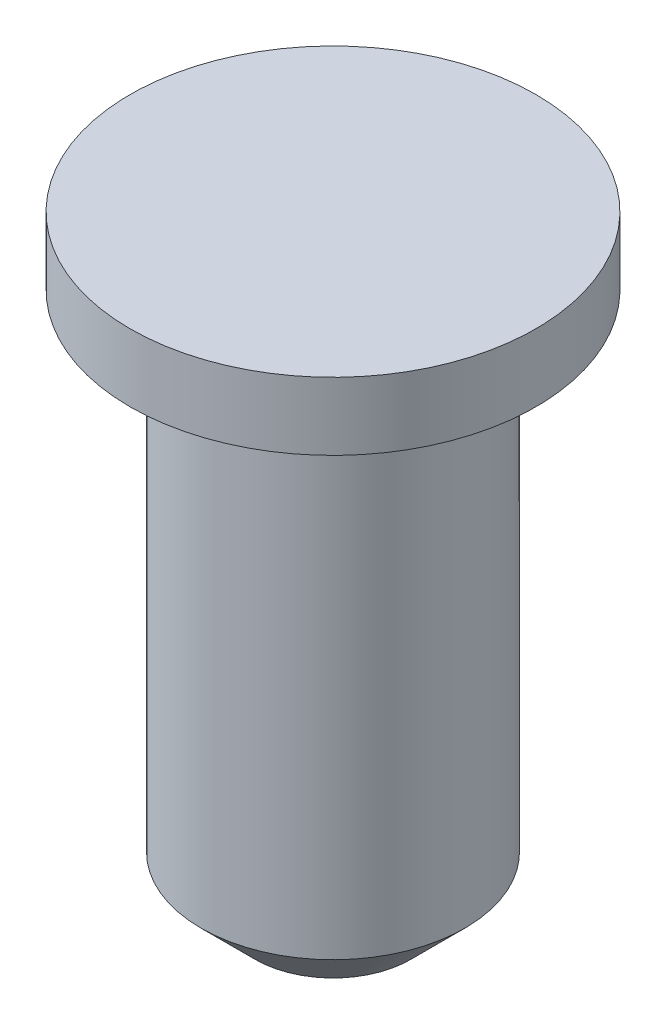
ISO-10303-21;
HEADER;
FILE_DESCRIPTION(('STEP AP214'),'2;1');
FILE_NAME('part.step','',(''),(''),'','','');
FILE_SCHEMA(('AUTOMOTIVE_DESIGN { 1 0 10303 214 1 1 1 1 }'));
ENDSEC;
DATA;
#1=APPLICATION_CONTEXT('core data for automotive mechanical design processes');
#2=APPLICATION_PROTOCOL_DEFINITION('international standard','automotive_design',2000,#1);
#3=PRODUCT_CONTEXT('',#1,'mechanical');
#4=PRODUCT('Part','Part','',(#3));
#5=PRODUCT_RELATED_PRODUCT_CATEGORY('part','',(#4));
#6=PRODUCT_DEFINITION_FORMATION('','',#4);
#7=PRODUCT_DEFINITION_CONTEXT('part definition',#1,'design');
#8=PRODUCT_DEFINITION('design','',#6,#7);
#9=PRODUCT_DEFINITION_SHAPE('','',#8);
#10=(LENGTH_UNIT() NAMED_UNIT(*) SI_UNIT(.MILLI.,.METRE.));
#11=(NAMED_UNIT(*) PLANE_ANGLE_UNIT() SI_UNIT($,.RADIAN.));
#12=(NAMED_UNIT(*) SI_UNIT($,.STERADIAN.) SOLID_ANGLE_UNIT());
#13=UNCERTAINTY_MEASURE_WITH_UNIT(LENGTH_MEASURE(1.E-05),#10,'distance_accuracy_value','');
#14=(GEOMETRIC_REPRESENTATION_CONTEXT(3) GLOBAL_UNCERTAINTY_ASSIGNED_CONTEXT((#13)) GLOBAL_UNIT_ASSIGNED_CONTEXT((#10,
#11,#12)) REPRESENTATION_CONTEXT('',''));
#15=CARTESIAN_POINT('',(0.,0.,0.));
#16=DIRECTION('',(0.,0.,1.));
#17=DIRECTION('',(1.,0.,0.));
#18=AXIS2_PLACEMENT_3D('',#15,#16,#17);
#19=CARTESIAN_POINT('',(0.,8.,0.));
#20=DIRECTION('',(0.,-1.,0.));
#21=DIRECTION('',(0.,0.,-1.));
#22=AXIS2_PLACEMENT_3D('',#19,#20,#21);
#23=CYLINDRICAL_SURFACE('',#22,1.95);
#24=CARTESIAN_POINT('',(0.,0.800000000000002,0.));
#25=DIRECTION('',(0.,1.,0.));
#26=DIRECTION('',(0.,0.,1.));
#27=AXIS2_PLACEMENT_3D('',#24,#25,#26);
#28=CIRCLE('',#27,1.95);
#29=CARTESIAN_POINT('',(0.,0.800000000000002,1.95));
#30=VERTEX_POINT('',#29);
#31=EDGE_CURVE('E41',#30,#30,#28,.T.);
#32=ORIENTED_EDGE('',*,*,#31,.T.);
#33=EDGE_LOOP('',(#32));
#34=FACE_BOUND('',#33,.T.);
#35=CARTESIAN_POINT('',(0.,8.,0.));
#36=DIRECTION('',(0.,1.,0.));
#37=DIRECTION('',(0.,0.,1.));
#38=AXIS2_PLACEMENT_3D('',#35,#36,#37);
#39=CIRCLE('',#38,1.95);
#40=CARTESIAN_POINT('',(0.,8.,1.95));
#41=VERTEX_POINT('',#40);
#42=EDGE_CURVE('E45',#41,#41,#39,.T.);
#43=ORIENTED_EDGE('',*,*,#42,.F.);
#44=EDGE_LOOP('',(#43));
#45=FACE_BOUND('',#44,.T.);
#46=ADVANCED_FACE('F33',(#34,#45),#23,.T.);
#47=CARTESIAN_POINT('',(0.,0.,0.));
#48=DIRECTION('',(0.,1.,0.));
#49=DIRECTION('',(0.,0.,1.));
#50=AXIS2_PLACEMENT_3D('',#47,#48,#49);
#51=PLANE('',#50);
#52=CARTESIAN_POINT('',(0.,0.,0.));
#53=DIRECTION('',(0.,1.,0.));
#54=DIRECTION('',(0.,0.,1.));
#55=AXIS2_PLACEMENT_3D('',#52,#53,#54);
#56=CIRCLE('',#55,1.14999999999999);
#57=CARTESIAN_POINT('',(0.,0.,1.14999999999999));
#58=VERTEX_POINT('',#57);
#59=EDGE_CURVE('E10',#58,#58,#56,.F.);
#60=ORIENTED_EDGE('',*,*,#59,.T.);
#61=EDGE_LOOP('',(#60));
#62=FACE_BOUND('',#61,.T.);
#63=ADVANCED_FACE('F63',(#62),#51,.F.);
#64=CARTESIAN_POINT('',(0.,9.,0.));
#65=DIRECTION('',(0.,-1.,0.));
#66=DIRECTION('',(0.,0.,-1.));
#67=AXIS2_PLACEMENT_3D('',#64,#65,#66);
#68=CYLINDRICAL_SURFACE('',#67,3.);
#69=CARTESIAN_POINT('',(0.,9.,0.));
#70=DIRECTION('',(0.,1.,0.));
#71=DIRECTION('',(0.,0.,1.));
#72=AXIS2_PLACEMENT_3D('',#69,#70,#71);
#73=CIRCLE('',#72,3.);
#74=CARTESIAN_POINT('',(0.,9.,3.));
#75=VERTEX_POINT('',#74);
#76=EDGE_CURVE('E49',#75,#75,#73,.T.);
#77=ORIENTED_EDGE('',*,*,#76,.F.);
#78=EDGE_LOOP('',(#77));
#79=FACE_BOUND('',#78,.T.);
#80=CARTESIAN_POINT('',(0.,8.,0.));
#81=DIRECTION('',(0.,1.,0.));
#82=DIRECTION('',(0.,0.,1.));
#83=AXIS2_PLACEMENT_3D('',#80,#81,#82);
#84=CIRCLE('',#83,3.);
#85=CARTESIAN_POINT('',(0.,8.,3.));
#86=VERTEX_POINT('',#85);
#87=EDGE_CURVE('E52',#86,#86,#84,.T.);
#88=ORIENTED_EDGE('',*,*,#87,.T.);
#89=EDGE_LOOP('',(#88));
#90=FACE_BOUND('',#89,.T.);
#91=ADVANCED_FACE('F60',(#79,#90),#68,.T.);
#92=CARTESIAN_POINT('',(0.,9.,0.));
#93=DIRECTION('',(0.,1.,0.));
#94=DIRECTION('',(0.,0.,1.));
#95=AXIS2_PLACEMENT_3D('',#92,#93,#94);
#96=PLANE('',#95);
#97=ORIENTED_EDGE('',*,*,#76,.T.);
#98=EDGE_LOOP('',(#97));
#99=FACE_BOUND('',#98,.T.);
#100=ADVANCED_FACE('F58',(#99),#96,.T.);
#101=CARTESIAN_POINT('',(0.,8.,0.));
#102=DIRECTION('',(0.,1.,0.));
#103=DIRECTION('',(0.,0.,1.));
#104=AXIS2_PLACEMENT_3D('',#101,#102,#103);
#105=PLANE('',#104);
#106=ORIENTED_EDGE('',*,*,#42,.T.);
#107=EDGE_LOOP('',(#106));
#108=FACE_BOUND('',#107,.T.);
#109=ORIENTED_EDGE('',*,*,#87,.F.);
#110=EDGE_LOOP('',(#109));
#111=FACE_BOUND('',#110,.T.);
#112=ADVANCED_FACE('F67',(#108,#111),#105,.F.);
#113=CARTESIAN_POINT('',(0.,0.800000000000002,0.));
#114=DIRECTION('',(0.,1.,0.));
#115=DIRECTION('',(0.,0.,1.));
#116=AXIS2_PLACEMENT_3D('',#113,#114,#115);
#117=CONICAL_SURFACE('',#116,1.95,0.78539816339745);
#118=ORIENTED_EDGE('',*,*,#59,.F.);
#119=EDGE_LOOP('',(#118));
#120=FACE_BOUND('',#119,.T.);
#121=ORIENTED_EDGE('',*,*,#31,.F.);
#122=EDGE_LOOP('',(#121));
#123=FACE_BOUND('',#122,.T.);
#124=ADVANCED_FACE('F36',(#120,#123),#117,.T.);
#125=CLOSED_SHELL('',(#46,#63,#91,#100,#112,#124));
#126=MANIFOLD_SOLID_BREP('B2',#125);
#127=ADVANCED_BREP_SHAPE_REPRESENTATION('',(#18,#126),#14);
#128=SHAPE_DEFINITION_REPRESENTATION(#9,#127);
ENDSEC;
END-ISO-10303-21;
